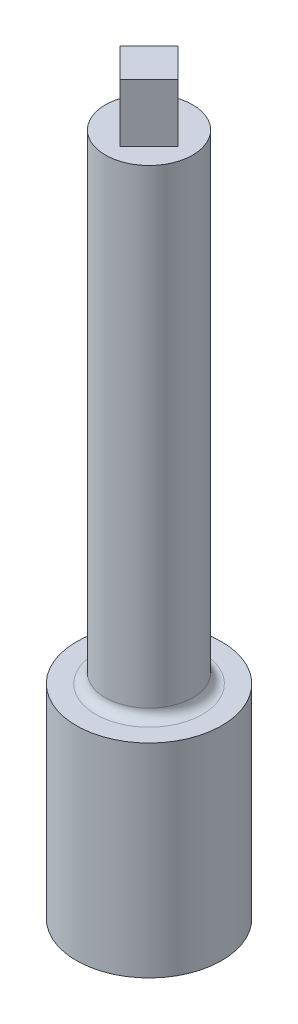
ISO-10303-21;
HEADER;
FILE_DESCRIPTION(('STEP AP214'),'2;1');
FILE_NAME('part.step','',(''),(''),'','','');
FILE_SCHEMA(('AUTOMOTIVE_DESIGN { 1 0 10303 214 1 1 1 1 }'));
ENDSEC;
DATA;
#1=APPLICATION_CONTEXT('core data for automotive mechanical design processes');
#2=APPLICATION_PROTOCOL_DEFINITION('international standard','automotive_design',2000,#1);
#3=PRODUCT_CONTEXT('',#1,'mechanical');
#4=PRODUCT('Part','Part','',(#3));
#5=PRODUCT_RELATED_PRODUCT_CATEGORY('part','',(#4));
#6=PRODUCT_DEFINITION_FORMATION('','',#4);
#7=PRODUCT_DEFINITION_CONTEXT('part definition',#1,'design');
#8=PRODUCT_DEFINITION('design','',#6,#7);
#9=PRODUCT_DEFINITION_SHAPE('','',#8);
#10=(LENGTH_UNIT() NAMED_UNIT(*) SI_UNIT(.MILLI.,.METRE.));
#11=(NAMED_UNIT(*) PLANE_ANGLE_UNIT() SI_UNIT($,.RADIAN.));
#12=(NAMED_UNIT(*) SI_UNIT($,.STERADIAN.) SOLID_ANGLE_UNIT());
#13=UNCERTAINTY_MEASURE_WITH_UNIT(LENGTH_MEASURE(1.E-05),#10,'distance_accuracy_value','');
#14=(GEOMETRIC_REPRESENTATION_CONTEXT(3) GLOBAL_UNCERTAINTY_ASSIGNED_CONTEXT((#13)) GLOBAL_UNIT_ASSIGNED_CONTEXT((#10,
#11,#12)) REPRESENTATION_CONTEXT('',''));
#15=CARTESIAN_POINT('',(0.,0.,0.));
#16=DIRECTION('',(0.,0.,1.));
#17=DIRECTION('',(1.,0.,0.));
#18=AXIS2_PLACEMENT_3D('',#15,#16,#17);
#19=CARTESIAN_POINT('',(0.,95.7119474912298,0.));
#20=DIRECTION('',(0.,-1.,0.));
#21=DIRECTION('',(0.,0.,-1.));
#22=AXIS2_PLACEMENT_3D('',#19,#20,#21);
#23=PLANE('',#22);
#24=CARTESIAN_POINT('',(0.,95.7119474912298,0.));
#25=DIRECTION('',(0.,-1.,0.));
#26=DIRECTION('',(0.,0.,-1.));
#27=AXIS2_PLACEMENT_3D('',#24,#25,#26);
#28=CIRCLE('',#27,9.00000000000001);
#29=CARTESIAN_POINT('',(0.,95.7119474912298,-9.00000000000001));
#30=VERTEX_POINT('',#29);
#31=EDGE_CURVE('E101',#30,#30,#28,.T.);
#32=ORIENTED_EDGE('',*,*,#31,.F.);
#33=EDGE_LOOP('',(#32));
#34=FACE_BOUND('',#33,.T.);
#35=DIRECTION('',(0.707106781186548,0.,-0.707106781186548));
#36=VECTOR('',#35,1.);
#37=CARTESIAN_POINT('',(0.,95.7119474912298,6.));
#38=LINE('',#37,#36);
#39=CARTESIAN_POINT('',(0.,95.7119474912298,6.));
#40=VERTEX_POINT('',#39);
#41=CARTESIAN_POINT('',(6.,95.7119474912298,0.));
#42=VERTEX_POINT('',#41);
#43=EDGE_CURVE('E69',#40,#42,#38,.T.);
#44=ORIENTED_EDGE('',*,*,#43,.F.);
#45=DIRECTION('',(0.707106781186548,0.,0.707106781186548));
#46=VECTOR('',#45,1.);
#47=CARTESIAN_POINT('',(-6.,95.7119474912298,0.));
#48=LINE('',#47,#46);
#49=CARTESIAN_POINT('',(-6.,95.7119474912298,0.));
#50=VERTEX_POINT('',#49);
#51=EDGE_CURVE('E71',#50,#40,#48,.T.);
#52=ORIENTED_EDGE('',*,*,#51,.F.);
#53=DIRECTION('',(-0.707106781186548,0.,0.707106781186548));
#54=VECTOR('',#53,1.);
#55=CARTESIAN_POINT('',(0.,95.7119474912298,-6.));
#56=LINE('',#55,#54);
#57=CARTESIAN_POINT('',(0.,95.7119474912298,-6.));
#58=VERTEX_POINT('',#57);
#59=EDGE_CURVE('E52',#58,#50,#56,.T.);
#60=ORIENTED_EDGE('',*,*,#59,.F.);
#61=DIRECTION('',(-0.707106781186548,0.,-0.707106781186548));
#62=VECTOR('',#61,1.);
#63=CARTESIAN_POINT('',(6.,95.7119474912298,0.));
#64=LINE('',#63,#62);
#65=EDGE_CURVE('E47',#42,#58,#64,.T.);
#66=ORIENTED_EDGE('',*,*,#65,.F.);
#67=EDGE_LOOP('',(#44,#52,#60,#66));
#68=FACE_BOUND('',#67,.T.);
#69=ADVANCED_FACE('F32',(#34,#68),#23,.F.);
#70=CARTESIAN_POINT('',(-6.,-13.2880525087702,0.));
#71=DIRECTION('',(0.,1.,0.));
#72=DIRECTION('',(0.,0.,1.));
#73=AXIS2_PLACEMENT_3D('',#70,#71,#72);
#74=PLANE('',#73);
#75=CARTESIAN_POINT('',(0.,-13.2880525087702,0.));
#76=DIRECTION('',(0.,-1.,0.));
#77=DIRECTION('',(0.,0.,-1.));
#78=AXIS2_PLACEMENT_3D('',#75,#76,#77);
#79=CIRCLE('',#78,6.);
#80=CARTESIAN_POINT('',(0.,-13.2880525087702,-6.));
#81=VERTEX_POINT('',#80);
#82=EDGE_CURVE('E11',#81,#81,#79,.T.);
#83=ORIENTED_EDGE('',*,*,#82,.T.);
#84=EDGE_LOOP('',(#83));
#85=FACE_BOUND('',#84,.T.);
#86=ADVANCED_FACE('F34',(#85),#74,.F.);
#87=CARTESIAN_POINT('',(0.,0.,0.));
#88=DIRECTION('',(0.,-1.,0.));
#89=DIRECTION('',(0.,0.,-1.));
#90=AXIS2_PLACEMENT_3D('',#87,#88,#89);
#91=CYLINDRICAL_SURFACE('',#90,6.);
#92=ORIENTED_EDGE('',*,*,#82,.F.);
#93=EDGE_LOOP('',(#92));
#94=FACE_BOUND('',#93,.T.);
#95=CARTESIAN_POINT('',(0.,-45.2880525087702,0.));
#96=DIRECTION('',(0.,-1.,0.));
#97=DIRECTION('',(0.,0.,-1.));
#98=AXIS2_PLACEMENT_3D('',#95,#96,#97);
#99=CIRCLE('',#98,6.);
#100=CARTESIAN_POINT('',(0.,-45.2880525087702,-6.));
#101=VERTEX_POINT('',#100);
#102=EDGE_CURVE('E40',#101,#101,#99,.T.);
#103=ORIENTED_EDGE('',*,*,#102,.T.);
#104=EDGE_LOOP('',(#103));
#105=FACE_BOUND('',#104,.T.);
#106=ADVANCED_FACE('F118',(#94,#105),#91,.F.);
#107=CARTESIAN_POINT('',(-15.,-45.2880525087702,0.));
#108=DIRECTION('',(0.,1.,0.));
#109=DIRECTION('',(0.,0.,1.));
#110=AXIS2_PLACEMENT_3D('',#107,#108,#109);
#111=PLANE('',#110);
#112=ORIENTED_EDGE('',*,*,#102,.F.);
#113=EDGE_LOOP('',(#112));
#114=FACE_BOUND('',#113,.T.);
#115=CARTESIAN_POINT('',(0.,-45.2880525087702,0.));
#116=DIRECTION('',(0.,-1.,0.));
#117=DIRECTION('',(0.,0.,-1.));
#118=AXIS2_PLACEMENT_3D('',#115,#116,#117);
#119=CIRCLE('',#118,15.);
#120=CARTESIAN_POINT('',(0.,-45.2880525087702,-15.));
#121=VERTEX_POINT('',#120);
#122=EDGE_CURVE('E113',#121,#121,#119,.T.);
#123=ORIENTED_EDGE('',*,*,#122,.T.);
#124=EDGE_LOOP('',(#123));
#125=FACE_BOUND('',#124,.T.);
#126=ADVANCED_FACE('F120',(#114,#125),#111,.F.);
#127=CARTESIAN_POINT('',(0.,0.,0.));
#128=DIRECTION('',(0.,-1.,0.));
#129=DIRECTION('',(0.,0.,-1.));
#130=AXIS2_PLACEMENT_3D('',#127,#128,#129);
#131=CYLINDRICAL_SURFACE('',#130,15.);
#132=ORIENTED_EDGE('',*,*,#122,.F.);
#133=EDGE_LOOP('',(#132));
#134=FACE_BOUND('',#133,.T.);
#135=CARTESIAN_POINT('',(0.,-3.28805250877016,0.));
#136=DIRECTION('',(0.,-1.,0.));
#137=DIRECTION('',(0.,0.,-1.));
#138=AXIS2_PLACEMENT_3D('',#135,#136,#137);
#139=CIRCLE('',#138,15.);
#140=CARTESIAN_POINT('',(0.,-3.28805250877016,-15.));
#141=VERTEX_POINT('',#140);
#142=EDGE_CURVE('E110',#141,#141,#139,.T.);
#143=ORIENTED_EDGE('',*,*,#142,.T.);
#144=EDGE_LOOP('',(#143));
#145=FACE_BOUND('',#144,.T.);
#146=ADVANCED_FACE('F123',(#134,#145),#131,.T.);
#147=CARTESIAN_POINT('',(-11.,-3.28805250877016,0.));
#148=DIRECTION('',(0.,-1.,0.));
#149=DIRECTION('',(0.,0.,-1.));
#150=AXIS2_PLACEMENT_3D('',#147,#148,#149);
#151=PLANE('',#150);
#152=ORIENTED_EDGE('',*,*,#142,.F.);
#153=EDGE_LOOP('',(#152));
#154=FACE_BOUND('',#153,.T.);
#155=CARTESIAN_POINT('',(0.,-3.28805250877016,0.));
#156=DIRECTION('',(0.,-1.,0.));
#157=DIRECTION('',(0.,0.,-1.));
#158=AXIS2_PLACEMENT_3D('',#155,#156,#157);
#159=CIRCLE('',#158,11.);
#160=CARTESIAN_POINT('',(0.,-3.28805250877016,-11.));
#161=VERTEX_POINT('',#160);
#162=EDGE_CURVE('E107',#161,#161,#159,.T.);
#163=ORIENTED_EDGE('',*,*,#162,.T.);
#164=EDGE_LOOP('',(#163));
#165=FACE_BOUND('',#164,.T.);
#166=ADVANCED_FACE('F129',(#154,#165),#151,.F.);
#167=CARTESIAN_POINT('',(0.,-1.28805250877016,0.));
#168=DIRECTION('',(0.,-1.,0.));
#169=DIRECTION('',(0.,0.,-1.));
#170=AXIS2_PLACEMENT_3D('',#167,#168,#169);
#171=TOROIDAL_SURFACE('',#170,11.,2.);
#172=ORIENTED_EDGE('',*,*,#162,.F.);
#173=EDGE_LOOP('',(#172));
#174=FACE_BOUND('',#173,.T.);
#175=CARTESIAN_POINT('',(0.,-1.28805250877015,0.));
#176=DIRECTION('',(0.,-1.,0.));
#177=DIRECTION('',(0.,0.,-1.));
#178=AXIS2_PLACEMENT_3D('',#175,#176,#177);
#179=CIRCLE('',#178,8.99999999999999);
#180=CARTESIAN_POINT('',(0.,-1.28805250877015,-8.99999999999999));
#181=VERTEX_POINT('',#180);
#182=EDGE_CURVE('E104',#181,#181,#179,.T.);
#183=ORIENTED_EDGE('',*,*,#182,.T.);
#184=EDGE_LOOP('',(#183));
#185=FACE_BOUND('',#184,.T.);
#186=ADVANCED_FACE('F135',(#174,#185),#171,.F.);
#187=CARTESIAN_POINT('',(0.,0.,0.));
#188=DIRECTION('',(0.,-1.,0.));
#189=DIRECTION('',(0.,0.,-1.));
#190=AXIS2_PLACEMENT_3D('',#187,#188,#189);
#191=CYLINDRICAL_SURFACE('',#190,9.);
#192=ORIENTED_EDGE('',*,*,#182,.F.);
#193=EDGE_LOOP('',(#192));
#194=FACE_BOUND('',#193,.T.);
#195=ORIENTED_EDGE('',*,*,#31,.T.);
#196=EDGE_LOOP('',(#195));
#197=FACE_BOUND('',#196,.T.);
#198=ADVANCED_FACE('F141',(#194,#197),#191,.T.);
#199=CARTESIAN_POINT('',(0.,107.71194749123,6.));
#200=DIRECTION('',(-0.707106781186548,0.,-0.707106781186548));
#201=DIRECTION('',(-0.707106781186548,0.,0.707106781186548));
#202=AXIS2_PLACEMENT_3D('',#199,#200,#201);
#203=PLANE('',#202);
#204=ORIENTED_EDGE('',*,*,#43,.T.);
#205=DIRECTION('',(0.,-1.,0.));
#206=VECTOR('',#205,1.);
#207=CARTESIAN_POINT('',(6.,107.71194749123,0.));
#208=LINE('',#207,#206);
#209=CARTESIAN_POINT('',(6.,107.71194749123,0.));
#210=VERTEX_POINT('',#209);
#211=EDGE_CURVE('E99',#210,#42,#208,.T.);
#212=ORIENTED_EDGE('',*,*,#211,.F.);
#213=DIRECTION('',(0.707106781186548,0.,-0.707106781186548));
#214=VECTOR('',#213,1.);
#215=CARTESIAN_POINT('',(0.,107.71194749123,6.));
#216=LINE('',#215,#214);
#217=CARTESIAN_POINT('',(0.,107.71194749123,6.));
#218=VERTEX_POINT('',#217);
#219=EDGE_CURVE('E85',#218,#210,#216,.T.);
#220=ORIENTED_EDGE('',*,*,#219,.F.);
#221=DIRECTION('',(0.,-1.,0.));
#222=VECTOR('',#221,1.);
#223=CARTESIAN_POINT('',(0.,107.71194749123,6.));
#224=LINE('',#223,#222);
#225=EDGE_CURVE('E81',#218,#40,#224,.T.);
#226=ORIENTED_EDGE('',*,*,#225,.T.);
#227=EDGE_LOOP('',(#204,#212,#220,#226));
#228=FACE_BOUND('',#227,.T.);
#229=ADVANCED_FACE('F87',(#228),#203,.F.);
#230=CARTESIAN_POINT('',(6.,107.71194749123,0.));
#231=DIRECTION('',(-0.707106781186548,0.,0.707106781186548));
#232=DIRECTION('',(0.707106781186548,0.,0.707106781186548));
#233=AXIS2_PLACEMENT_3D('',#230,#231,#232);
#234=PLANE('',#233);
#235=ORIENTED_EDGE('',*,*,#65,.T.);
#236=DIRECTION('',(0.,-1.,0.));
#237=VECTOR('',#236,1.);
#238=CARTESIAN_POINT('',(0.,107.71194749123,-6.));
#239=LINE('',#238,#237);
#240=CARTESIAN_POINT('',(0.,107.71194749123,-6.));
#241=VERTEX_POINT('',#240);
#242=EDGE_CURVE('E91',#241,#58,#239,.T.);
#243=ORIENTED_EDGE('',*,*,#242,.F.);
#244=DIRECTION('',(-0.707106781186548,0.,-0.707106781186548));
#245=VECTOR('',#244,1.);
#246=CARTESIAN_POINT('',(6.,107.71194749123,0.));
#247=LINE('',#246,#245);
#248=EDGE_CURVE('E251',#210,#241,#247,.T.);
#249=ORIENTED_EDGE('',*,*,#248,.F.);
#250=ORIENTED_EDGE('',*,*,#211,.T.);
#251=EDGE_LOOP('',(#235,#243,#249,#250));
#252=FACE_BOUND('',#251,.T.);
#253=ADVANCED_FACE('F191',(#252),#234,.F.);
#254=CARTESIAN_POINT('',(0.,107.71194749123,-6.));
#255=DIRECTION('',(0.707106781186548,0.,0.707106781186548));
#256=DIRECTION('',(0.707106781186548,0.,-0.707106781186548));
#257=AXIS2_PLACEMENT_3D('',#254,#255,#256);
#258=PLANE('',#257);
#259=ORIENTED_EDGE('',*,*,#59,.T.);
#260=DIRECTION('',(0.,-1.,0.));
#261=VECTOR('',#260,1.);
#262=CARTESIAN_POINT('',(-6.,107.71194749123,0.));
#263=LINE('',#262,#261);
#264=CARTESIAN_POINT('',(-6.,107.71194749123,0.));
#265=VERTEX_POINT('',#264);
#266=EDGE_CURVE('E84',#265,#50,#263,.T.);
#267=ORIENTED_EDGE('',*,*,#266,.F.);
#268=DIRECTION('',(-0.707106781186548,0.,0.707106781186548));
#269=VECTOR('',#268,1.);
#270=CARTESIAN_POINT('',(0.,107.71194749123,-6.));
#271=LINE('',#270,#269);
#272=EDGE_CURVE('E93',#241,#265,#271,.T.);
#273=ORIENTED_EDGE('',*,*,#272,.F.);
#274=ORIENTED_EDGE('',*,*,#242,.T.);
#275=EDGE_LOOP('',(#259,#267,#273,#274));
#276=FACE_BOUND('',#275,.T.);
#277=ADVANCED_FACE('F197',(#276),#258,.F.);
#278=CARTESIAN_POINT('',(-6.,107.71194749123,0.));
#279=DIRECTION('',(0.707106781186548,0.,-0.707106781186548));
#280=DIRECTION('',(-0.707106781186548,0.,-0.707106781186548));
#281=AXIS2_PLACEMENT_3D('',#278,#279,#280);
#282=PLANE('',#281);
#283=ORIENTED_EDGE('',*,*,#51,.T.);
#284=ORIENTED_EDGE('',*,*,#225,.F.);
#285=DIRECTION('',(0.707106781186548,0.,0.707106781186548));
#286=VECTOR('',#285,1.);
#287=CARTESIAN_POINT('',(-6.,107.71194749123,0.));
#288=LINE('',#287,#286);
#289=EDGE_CURVE('E89',#265,#218,#288,.T.);
#290=ORIENTED_EDGE('',*,*,#289,.F.);
#291=ORIENTED_EDGE('',*,*,#266,.T.);
#292=EDGE_LOOP('',(#283,#284,#290,#291));
#293=FACE_BOUND('',#292,.T.);
#294=ADVANCED_FACE('F79',(#293),#282,.F.);
#295=CARTESIAN_POINT('',(0.,107.71194749123,6.));
#296=DIRECTION('',(0.,-1.,0.));
#297=DIRECTION('',(0.,0.,-1.));
#298=AXIS2_PLACEMENT_3D('',#295,#296,#297);
#299=PLANE('',#298);
#300=ORIENTED_EDGE('',*,*,#219,.T.);
#301=ORIENTED_EDGE('',*,*,#248,.T.);
#302=ORIENTED_EDGE('',*,*,#272,.T.);
#303=ORIENTED_EDGE('',*,*,#289,.T.);
#304=EDGE_LOOP('',(#300,#301,#302,#303));
#305=FACE_BOUND('',#304,.T.);
#306=ADVANCED_FACE('F211',(#305),#299,.F.);
#307=CLOSED_SHELL('',(#69,#86,#106,#126,#146,#166,#186,#198,#229,#253,#277,#294,#306));
#308=MANIFOLD_SOLID_BREP('B2',#307);
#309=ADVANCED_BREP_SHAPE_REPRESENTATION('',(#18,#308),#14);
#310=SHAPE_DEFINITION_REPRESENTATION(#9,#309);
ENDSEC;
END-ISO-10303-21;
